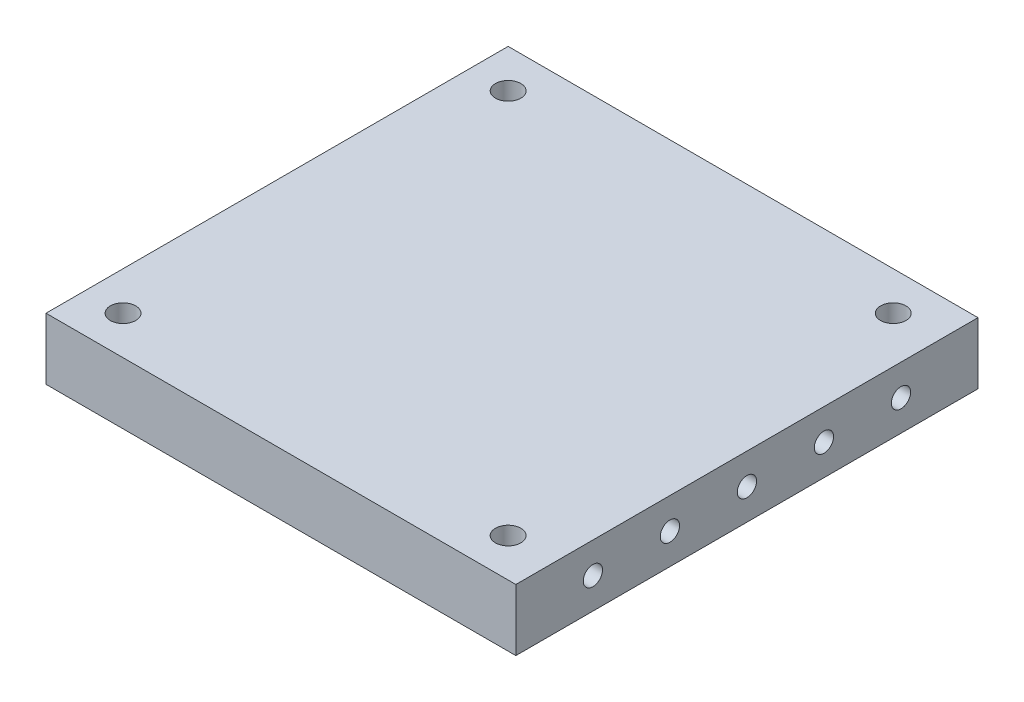
ISO-10303-21;
HEADER;
FILE_DESCRIPTION(('STEP AP214'),'2;1');
FILE_NAME('part.step','',(''),(''),'','','');
FILE_SCHEMA(('AUTOMOTIVE_DESIGN { 1 0 10303 214 1 1 1 1 }'));
ENDSEC;
DATA;
#1=APPLICATION_CONTEXT('core data for automotive mechanical design processes');
#2=APPLICATION_PROTOCOL_DEFINITION('international standard','automotive_design',2000,#1);
#3=PRODUCT_CONTEXT('',#1,'mechanical');
#4=PRODUCT('Part','Part','',(#3));
#5=PRODUCT_RELATED_PRODUCT_CATEGORY('part','',(#4));
#6=PRODUCT_DEFINITION_FORMATION('','',#4);
#7=PRODUCT_DEFINITION_CONTEXT('part definition',#1,'design');
#8=PRODUCT_DEFINITION('design','',#6,#7);
#9=PRODUCT_DEFINITION_SHAPE('','',#8);
#10=(LENGTH_UNIT() NAMED_UNIT(*) SI_UNIT(.MILLI.,.METRE.));
#11=(NAMED_UNIT(*) PLANE_ANGLE_UNIT() SI_UNIT($,.RADIAN.));
#12=(NAMED_UNIT(*) SI_UNIT($,.STERADIAN.) SOLID_ANGLE_UNIT());
#13=UNCERTAINTY_MEASURE_WITH_UNIT(LENGTH_MEASURE(1.E-05),#10,'distance_accuracy_value','');
#14=(GEOMETRIC_REPRESENTATION_CONTEXT(3) GLOBAL_UNCERTAINTY_ASSIGNED_CONTEXT((#13)) GLOBAL_UNIT_ASSIGNED_CONTEXT((#10,
#11,#12)) REPRESENTATION_CONTEXT('',''));
#15=CARTESIAN_POINT('',(0.,0.,0.));
#16=DIRECTION('',(0.,0.,1.));
#17=DIRECTION('',(1.,0.,0.));
#18=AXIS2_PLACEMENT_3D('',#15,#16,#17);
#19=CARTESIAN_POINT('',(0.,8.,0.));
#20=DIRECTION('',(1.,0.,0.));
#21=DIRECTION('',(0.,0.,-1.));
#22=AXIS2_PLACEMENT_3D('',#19,#20,#21);
#23=PLANE('',#22);
#24=DIRECTION('',(0.,0.,1.));
#25=VECTOR('',#24,1.);
#26=CARTESIAN_POINT('',(0.,0.,0.));
#27=LINE('',#26,#25);
#28=CARTESIAN_POINT('',(0.,0.,0.));
#29=VERTEX_POINT('',#28);
#30=CARTESIAN_POINT('',(0.,0.,60.));
#31=VERTEX_POINT('',#30);
#32=EDGE_CURVE('E131',#29,#31,#27,.T.);
#33=ORIENTED_EDGE('',*,*,#32,.T.);
#34=DIRECTION('',(0.,-1.,0.));
#35=VECTOR('',#34,1.);
#36=CARTESIAN_POINT('',(0.,8.,60.));
#37=LINE('',#36,#35);
#38=CARTESIAN_POINT('',(0.,8.,60.));
#39=VERTEX_POINT('',#38);
#40=EDGE_CURVE('E11',#39,#31,#37,.T.);
#41=ORIENTED_EDGE('',*,*,#40,.F.);
#42=DIRECTION('',(0.,0.,1.));
#43=VECTOR('',#42,1.);
#44=CARTESIAN_POINT('',(0.,8.,0.));
#45=LINE('',#44,#43);
#46=CARTESIAN_POINT('',(0.,8.,0.));
#47=VERTEX_POINT('',#46);
#48=EDGE_CURVE('E134',#47,#39,#45,.T.);
#49=ORIENTED_EDGE('',*,*,#48,.F.);
#50=DIRECTION('',(0.,-1.,0.));
#51=VECTOR('',#50,1.);
#52=CARTESIAN_POINT('',(0.,8.,0.));
#53=LINE('',#52,#51);
#54=EDGE_CURVE('E49',#47,#29,#53,.T.);
#55=ORIENTED_EDGE('',*,*,#54,.T.);
#56=EDGE_LOOP('',(#33,#41,#49,#55));
#57=FACE_BOUND('',#56,.T.);
#58=ADVANCED_FACE('F41',(#57),#23,.F.);
#59=CARTESIAN_POINT('',(0.,8.,60.));
#60=DIRECTION('',(0.,0.,-1.));
#61=DIRECTION('',(-1.,0.,0.));
#62=AXIS2_PLACEMENT_3D('',#59,#60,#61);
#63=PLANE('',#62);
#64=DIRECTION('',(1.,0.,0.));
#65=VECTOR('',#64,1.);
#66=CARTESIAN_POINT('',(0.,0.,60.));
#67=LINE('',#66,#65);
#68=CARTESIAN_POINT('',(61.,0.,60.));
#69=VERTEX_POINT('',#68);
#70=EDGE_CURVE('E69',#31,#69,#67,.T.);
#71=ORIENTED_EDGE('',*,*,#70,.T.);
#72=DIRECTION('',(0.,1.,0.));
#73=VECTOR('',#72,1.);
#74=CARTESIAN_POINT('',(61.,0.,60.));
#75=LINE('',#74,#73);
#76=CARTESIAN_POINT('',(61.,8.,60.));
#77=VERTEX_POINT('',#76);
#78=EDGE_CURVE('E97',#69,#77,#75,.T.);
#79=ORIENTED_EDGE('',*,*,#78,.T.);
#80=DIRECTION('',(1.,0.,0.));
#81=VECTOR('',#80,1.);
#82=CARTESIAN_POINT('',(0.,8.,60.));
#83=LINE('',#82,#81);
#84=EDGE_CURVE('E88',#39,#77,#83,.T.);
#85=ORIENTED_EDGE('',*,*,#84,.F.);
#86=ORIENTED_EDGE('',*,*,#40,.T.);
#87=EDGE_LOOP('',(#71,#79,#85,#86));
#88=FACE_BOUND('',#87,.T.);
#89=ADVANCED_FACE('F160',(#88),#63,.F.);
#90=CARTESIAN_POINT('',(0.,8.,0.));
#91=DIRECTION('',(0.,0.,1.));
#92=DIRECTION('',(1.,0.,0.));
#93=AXIS2_PLACEMENT_3D('',#90,#91,#92);
#94=PLANE('',#93);
#95=DIRECTION('',(-1.,0.,0.));
#96=VECTOR('',#95,1.);
#97=CARTESIAN_POINT('',(0.,0.,0.));
#98=LINE('',#97,#96);
#99=CARTESIAN_POINT('',(61.,0.,-5.6843418860808E-11));
#100=VERTEX_POINT('',#99);
#101=EDGE_CURVE('E74',#100,#29,#98,.T.);
#102=ORIENTED_EDGE('',*,*,#101,.T.);
#103=ORIENTED_EDGE('',*,*,#54,.F.);
#104=DIRECTION('',(-1.,0.,0.));
#105=VECTOR('',#104,1.);
#106=CARTESIAN_POINT('',(0.,8.,0.));
#107=LINE('',#106,#105);
#108=CARTESIAN_POINT('',(61.,8.,-5.6843418860808E-11));
#109=VERTEX_POINT('',#108);
#110=EDGE_CURVE('E57',#109,#47,#107,.T.);
#111=ORIENTED_EDGE('',*,*,#110,.F.);
#112=DIRECTION('',(0.,1.,0.));
#113=VECTOR('',#112,1.);
#114=CARTESIAN_POINT('',(61.,0.,-5.6843418860808E-11));
#115=LINE('',#114,#113);
#116=EDGE_CURVE('E84',#100,#109,#115,.T.);
#117=ORIENTED_EDGE('',*,*,#116,.F.);
#118=EDGE_LOOP('',(#102,#103,#111,#117));
#119=FACE_BOUND('',#118,.T.);
#120=ADVANCED_FACE('F83',(#119),#94,.F.);
#121=CARTESIAN_POINT('',(0.,8.,0.));
#122=DIRECTION('',(0.,1.,0.));
#123=DIRECTION('',(0.,0.,1.));
#124=AXIS2_PLACEMENT_3D('',#121,#122,#123);
#125=PLANE('',#124);
#126=CARTESIAN_POINT('',(55.,8.,5.));
#127=DIRECTION('',(0.,1.,0.));
#128=DIRECTION('',(0.,0.,1.));
#129=AXIS2_PLACEMENT_3D('',#126,#127,#128);
#130=CIRCLE('',#129,1.65);
#131=CARTESIAN_POINT('',(55.,8.,6.65));
#132=VERTEX_POINT('',#131);
#133=EDGE_CURVE('E116',#132,#132,#130,.T.);
#134=ORIENTED_EDGE('',*,*,#133,.F.);
#135=EDGE_LOOP('',(#134));
#136=FACE_BOUND('',#135,.T.);
#137=CARTESIAN_POINT('',(5.,8.,55.));
#138=DIRECTION('',(0.,1.,0.));
#139=DIRECTION('',(0.,0.,1.));
#140=AXIS2_PLACEMENT_3D('',#137,#138,#139);
#141=CIRCLE('',#140,1.65);
#142=CARTESIAN_POINT('',(5.,8.,56.65));
#143=VERTEX_POINT('',#142);
#144=EDGE_CURVE('E123',#143,#143,#141,.T.);
#145=ORIENTED_EDGE('',*,*,#144,.F.);
#146=EDGE_LOOP('',(#145));
#147=FACE_BOUND('',#146,.T.);
#148=CARTESIAN_POINT('',(55.,8.,55.));
#149=DIRECTION('',(0.,1.,0.));
#150=DIRECTION('',(0.,0.,1.));
#151=AXIS2_PLACEMENT_3D('',#148,#149,#150);
#152=CIRCLE('',#151,1.65);
#153=CARTESIAN_POINT('',(55.,8.,56.65));
#154=VERTEX_POINT('',#153);
#155=EDGE_CURVE('E110',#154,#154,#152,.T.);
#156=ORIENTED_EDGE('',*,*,#155,.F.);
#157=EDGE_LOOP('',(#156));
#158=FACE_BOUND('',#157,.T.);
#159=CARTESIAN_POINT('',(5.,8.,5.));
#160=DIRECTION('',(0.,1.,0.));
#161=DIRECTION('',(0.,0.,1.));
#162=AXIS2_PLACEMENT_3D('',#159,#160,#161);
#163=CIRCLE('',#162,1.65);
#164=CARTESIAN_POINT('',(5.,8.,6.65));
#165=VERTEX_POINT('',#164);
#166=EDGE_CURVE('E119',#165,#165,#163,.T.);
#167=ORIENTED_EDGE('',*,*,#166,.F.);
#168=EDGE_LOOP('',(#167));
#169=FACE_BOUND('',#168,.T.);
#170=ORIENTED_EDGE('',*,*,#48,.T.);
#171=ORIENTED_EDGE('',*,*,#84,.T.);
#172=DIRECTION('',(0.,0.,-1.));
#173=VECTOR('',#172,1.);
#174=CARTESIAN_POINT('',(61.,8.,60.));
#175=LINE('',#174,#173);
#176=EDGE_CURVE('E94',#77,#109,#175,.T.);
#177=ORIENTED_EDGE('',*,*,#176,.T.);
#178=ORIENTED_EDGE('',*,*,#110,.T.);
#179=EDGE_LOOP('',(#170,#171,#177,#178));
#180=FACE_BOUND('',#179,.T.);
#181=ADVANCED_FACE('F99',(#136,#147,#158,#169,#180),#125,.T.);
#182=CARTESIAN_POINT('',(0.,0.,0.));
#183=DIRECTION('',(0.,1.,0.));
#184=DIRECTION('',(0.,0.,1.));
#185=AXIS2_PLACEMENT_3D('',#182,#183,#184);
#186=PLANE('',#185);
#187=CARTESIAN_POINT('',(55.,0.,5.));
#188=DIRECTION('',(0.,1.,0.));
#189=DIRECTION('',(0.,0.,1.));
#190=AXIS2_PLACEMENT_3D('',#187,#188,#189);
#191=CIRCLE('',#190,1.65);
#192=CARTESIAN_POINT('',(55.,0.,6.65));
#193=VERTEX_POINT('',#192);
#194=EDGE_CURVE('E120',#193,#193,#191,.T.);
#195=ORIENTED_EDGE('',*,*,#194,.T.);
#196=EDGE_LOOP('',(#195));
#197=FACE_BOUND('',#196,.T.);
#198=CARTESIAN_POINT('',(5.,0.,55.));
#199=DIRECTION('',(0.,1.,0.));
#200=DIRECTION('',(0.,0.,1.));
#201=AXIS2_PLACEMENT_3D('',#198,#199,#200);
#202=CIRCLE('',#201,1.65);
#203=CARTESIAN_POINT('',(5.,0.,56.65));
#204=VERTEX_POINT('',#203);
#205=EDGE_CURVE('E113',#204,#204,#202,.T.);
#206=ORIENTED_EDGE('',*,*,#205,.T.);
#207=EDGE_LOOP('',(#206));
#208=FACE_BOUND('',#207,.T.);
#209=CARTESIAN_POINT('',(55.,0.,55.));
#210=DIRECTION('',(0.,1.,0.));
#211=DIRECTION('',(0.,0.,1.));
#212=AXIS2_PLACEMENT_3D('',#209,#210,#211);
#213=CIRCLE('',#212,1.65);
#214=CARTESIAN_POINT('',(55.,0.,56.65));
#215=VERTEX_POINT('',#214);
#216=EDGE_CURVE('E96',#215,#215,#213,.T.);
#217=ORIENTED_EDGE('',*,*,#216,.T.);
#218=EDGE_LOOP('',(#217));
#219=FACE_BOUND('',#218,.T.);
#220=CARTESIAN_POINT('',(5.,0.,5.));
#221=DIRECTION('',(0.,1.,0.));
#222=DIRECTION('',(0.,0.,1.));
#223=AXIS2_PLACEMENT_3D('',#220,#221,#222);
#224=CIRCLE('',#223,1.65);
#225=CARTESIAN_POINT('',(5.,0.,6.65));
#226=VERTEX_POINT('',#225);
#227=EDGE_CURVE('E128',#226,#226,#224,.T.);
#228=ORIENTED_EDGE('',*,*,#227,.T.);
#229=EDGE_LOOP('',(#228));
#230=FACE_BOUND('',#229,.T.);
#231=ORIENTED_EDGE('',*,*,#32,.F.);
#232=ORIENTED_EDGE('',*,*,#101,.F.);
#233=DIRECTION('',(0.,0.,-1.));
#234=VECTOR('',#233,1.);
#235=CARTESIAN_POINT('',(61.,0.,60.));
#236=LINE('',#235,#234);
#237=EDGE_CURVE('E95',#69,#100,#236,.T.);
#238=ORIENTED_EDGE('',*,*,#237,.F.);
#239=ORIENTED_EDGE('',*,*,#70,.F.);
#240=EDGE_LOOP('',(#231,#232,#238,#239));
#241=FACE_BOUND('',#240,.T.);
#242=ADVANCED_FACE('F142',(#197,#208,#219,#230,#241),#186,.F.);
#243=CARTESIAN_POINT('',(5.,0.,5.));
#244=DIRECTION('',(0.,1.,0.));
#245=DIRECTION('',(0.,0.,1.));
#246=AXIS2_PLACEMENT_3D('',#243,#244,#245);
#247=CYLINDRICAL_SURFACE('',#246,1.65);
#248=ORIENTED_EDGE('',*,*,#227,.F.);
#249=EDGE_LOOP('',(#248));
#250=FACE_BOUND('',#249,.T.);
#251=ORIENTED_EDGE('',*,*,#166,.T.);
#252=EDGE_LOOP('',(#251));
#253=FACE_BOUND('',#252,.T.);
#254=ADVANCED_FACE('F144',(#250,#253),#247,.F.);
#255=CARTESIAN_POINT('',(55.,0.,55.));
#256=DIRECTION('',(0.,1.,0.));
#257=DIRECTION('',(0.,0.,1.));
#258=AXIS2_PLACEMENT_3D('',#255,#256,#257);
#259=CYLINDRICAL_SURFACE('',#258,1.65);
#260=ORIENTED_EDGE('',*,*,#216,.F.);
#261=EDGE_LOOP('',(#260));
#262=FACE_BOUND('',#261,.T.);
#263=ORIENTED_EDGE('',*,*,#155,.T.);
#264=EDGE_LOOP('',(#263));
#265=FACE_BOUND('',#264,.T.);
#266=ADVANCED_FACE('F152',(#262,#265),#259,.F.);
#267=CARTESIAN_POINT('',(5.,0.,55.));
#268=DIRECTION('',(0.,1.,0.));
#269=DIRECTION('',(0.,0.,1.));
#270=AXIS2_PLACEMENT_3D('',#267,#268,#269);
#271=CYLINDRICAL_SURFACE('',#270,1.65);
#272=ORIENTED_EDGE('',*,*,#205,.F.);
#273=EDGE_LOOP('',(#272));
#274=FACE_BOUND('',#273,.T.);
#275=ORIENTED_EDGE('',*,*,#144,.T.);
#276=EDGE_LOOP('',(#275));
#277=FACE_BOUND('',#276,.T.);
#278=ADVANCED_FACE('F302',(#274,#277),#271,.F.);
#279=CARTESIAN_POINT('',(55.,0.,5.));
#280=DIRECTION('',(0.,1.,0.));
#281=DIRECTION('',(0.,0.,1.));
#282=AXIS2_PLACEMENT_3D('',#279,#280,#281);
#283=CYLINDRICAL_SURFACE('',#282,1.65);
#284=ORIENTED_EDGE('',*,*,#194,.F.);
#285=EDGE_LOOP('',(#284));
#286=FACE_BOUND('',#285,.T.);
#287=ORIENTED_EDGE('',*,*,#133,.T.);
#288=EDGE_LOOP('',(#287));
#289=FACE_BOUND('',#288,.T.);
#290=ADVANCED_FACE('F195',(#286,#289),#283,.F.);
#291=CARTESIAN_POINT('',(61.,0.,60.));
#292=DIRECTION('',(1.,0.,0.));
#293=DIRECTION('',(0.,0.,-1.));
#294=AXIS2_PLACEMENT_3D('',#291,#292,#293);
#295=PLANE('',#294);
#296=CARTESIAN_POINT('',(61.,4.,50.));
#297=DIRECTION('',(1.,0.,0.));
#298=DIRECTION('',(0.,0.,-1.));
#299=AXIS2_PLACEMENT_3D('',#296,#297,#298);
#300=CIRCLE('',#299,1.25);
#301=CARTESIAN_POINT('',(61.,4.,48.75));
#302=VERTEX_POINT('',#301);
#303=EDGE_CURVE('E105',#302,#302,#300,.T.);
#304=ORIENTED_EDGE('',*,*,#303,.F.);
#305=EDGE_LOOP('',(#304));
#306=FACE_BOUND('',#305,.T.);
#307=CARTESIAN_POINT('',(61.,4.,40.));
#308=DIRECTION('',(1.,0.,0.));
#309=DIRECTION('',(0.,0.,-1.));
#310=AXIS2_PLACEMENT_3D('',#307,#308,#309);
#311=CIRCLE('',#310,1.25);
#312=CARTESIAN_POINT('',(61.,4.,38.75));
#313=VERTEX_POINT('',#312);
#314=EDGE_CURVE('E368',#313,#313,#311,.T.);
#315=ORIENTED_EDGE('',*,*,#314,.F.);
#316=EDGE_LOOP('',(#315));
#317=FACE_BOUND('',#316,.T.);
#318=CARTESIAN_POINT('',(61.,4.,30.));
#319=DIRECTION('',(1.,0.,0.));
#320=DIRECTION('',(0.,0.,-1.));
#321=AXIS2_PLACEMENT_3D('',#318,#319,#320);
#322=CIRCLE('',#321,1.25);
#323=CARTESIAN_POINT('',(61.,4.,28.75));
#324=VERTEX_POINT('',#323);
#325=EDGE_CURVE('E376',#324,#324,#322,.T.);
#326=ORIENTED_EDGE('',*,*,#325,.F.);
#327=EDGE_LOOP('',(#326));
#328=FACE_BOUND('',#327,.T.);
#329=CARTESIAN_POINT('',(61.,4.,10.));
#330=DIRECTION('',(1.,0.,0.));
#331=DIRECTION('',(0.,0.,-1.));
#332=AXIS2_PLACEMENT_3D('',#329,#330,#331);
#333=CIRCLE('',#332,1.25);
#334=CARTESIAN_POINT('',(61.,4.,8.75));
#335=VERTEX_POINT('',#334);
#336=EDGE_CURVE('E382',#335,#335,#333,.T.);
#337=ORIENTED_EDGE('',*,*,#336,.F.);
#338=EDGE_LOOP('',(#337));
#339=FACE_BOUND('',#338,.T.);
#340=CARTESIAN_POINT('',(61.,4.,20.));
#341=DIRECTION('',(1.,0.,0.));
#342=DIRECTION('',(0.,0.,-1.));
#343=AXIS2_PLACEMENT_3D('',#340,#341,#342);
#344=CIRCLE('',#343,1.25);
#345=CARTESIAN_POINT('',(61.,4.,18.75));
#346=VERTEX_POINT('',#345);
#347=EDGE_CURVE('E388',#346,#346,#344,.T.);
#348=ORIENTED_EDGE('',*,*,#347,.F.);
#349=EDGE_LOOP('',(#348));
#350=FACE_BOUND('',#349,.T.);
#351=ORIENTED_EDGE('',*,*,#176,.F.);
#352=ORIENTED_EDGE('',*,*,#78,.F.);
#353=ORIENTED_EDGE('',*,*,#237,.T.);
#354=ORIENTED_EDGE('',*,*,#116,.T.);
#355=EDGE_LOOP('',(#351,#352,#353,#354));
#356=FACE_BOUND('',#355,.T.);
#357=ADVANCED_FACE('F92',(#306,#317,#328,#339,#350,#356),#295,.T.);
#358=CARTESIAN_POINT('',(52.,4.,20.));
#359=DIRECTION('',(1.,0.,0.));
#360=DIRECTION('',(0.,0.,-1.));
#361=AXIS2_PLACEMENT_3D('',#358,#359,#360);
#362=CYLINDRICAL_SURFACE('',#361,1.25);
#363=CARTESIAN_POINT('',(52.,4.,20.));
#364=DIRECTION('',(1.,0.,0.));
#365=DIRECTION('',(0.,0.,-1.));
#366=AXIS2_PLACEMENT_3D('',#363,#364,#365);
#367=CIRCLE('',#366,1.25);
#368=CARTESIAN_POINT('',(52.,4.,18.75));
#369=VERTEX_POINT('',#368);
#370=EDGE_CURVE('E390',#369,#369,#367,.T.);
#371=ORIENTED_EDGE('',*,*,#370,.F.);
#372=EDGE_LOOP('',(#371));
#373=FACE_BOUND('',#372,.T.);
#374=ORIENTED_EDGE('',*,*,#347,.T.);
#375=EDGE_LOOP('',(#374));
#376=FACE_BOUND('',#375,.T.);
#377=ADVANCED_FACE('F194',(#373,#376),#362,.F.);
#378=CARTESIAN_POINT('',(52.,4.,20.));
#379=DIRECTION('',(1.,0.,0.));
#380=DIRECTION('',(0.,0.,-1.));
#381=AXIS2_PLACEMENT_3D('',#378,#379,#380);
#382=PLANE('',#381);
#383=ORIENTED_EDGE('',*,*,#370,.T.);
#384=EDGE_LOOP('',(#383));
#385=FACE_BOUND('',#384,.T.);
#386=ADVANCED_FACE('F206',(#385),#382,.T.);
#387=CARTESIAN_POINT('',(52.,4.,10.));
#388=DIRECTION('',(1.,0.,0.));
#389=DIRECTION('',(0.,0.,-1.));
#390=AXIS2_PLACEMENT_3D('',#387,#388,#389);
#391=CYLINDRICAL_SURFACE('',#390,1.25);
#392=CARTESIAN_POINT('',(52.,4.,10.));
#393=DIRECTION('',(1.,0.,0.));
#394=DIRECTION('',(0.,0.,-1.));
#395=AXIS2_PLACEMENT_3D('',#392,#393,#394);
#396=CIRCLE('',#395,1.25);
#397=CARTESIAN_POINT('',(52.,4.,8.75));
#398=VERTEX_POINT('',#397);
#399=EDGE_CURVE('E385',#398,#398,#396,.T.);
#400=ORIENTED_EDGE('',*,*,#399,.F.);
#401=EDGE_LOOP('',(#400));
#402=FACE_BOUND('',#401,.T.);
#403=ORIENTED_EDGE('',*,*,#336,.T.);
#404=EDGE_LOOP('',(#403));
#405=FACE_BOUND('',#404,.T.);
#406=ADVANCED_FACE('F216',(#402,#405),#391,.F.);
#407=CARTESIAN_POINT('',(52.,4.,10.));
#408=DIRECTION('',(1.,0.,0.));
#409=DIRECTION('',(0.,0.,-1.));
#410=AXIS2_PLACEMENT_3D('',#407,#408,#409);
#411=PLANE('',#410);
#412=ORIENTED_EDGE('',*,*,#399,.T.);
#413=EDGE_LOOP('',(#412));
#414=FACE_BOUND('',#413,.T.);
#415=ADVANCED_FACE('F226',(#414),#411,.T.);
#416=CARTESIAN_POINT('',(52.,4.,30.));
#417=DIRECTION('',(1.,0.,0.));
#418=DIRECTION('',(0.,0.,-1.));
#419=AXIS2_PLACEMENT_3D('',#416,#417,#418);
#420=CYLINDRICAL_SURFACE('',#419,1.25);
#421=CARTESIAN_POINT('',(52.,4.,30.));
#422=DIRECTION('',(1.,0.,0.));
#423=DIRECTION('',(0.,0.,-1.));
#424=AXIS2_PLACEMENT_3D('',#421,#422,#423);
#425=CIRCLE('',#424,1.25);
#426=CARTESIAN_POINT('',(52.,4.,28.75));
#427=VERTEX_POINT('',#426);
#428=EDGE_CURVE('E379',#427,#427,#425,.T.);
#429=ORIENTED_EDGE('',*,*,#428,.F.);
#430=EDGE_LOOP('',(#429));
#431=FACE_BOUND('',#430,.T.);
#432=ORIENTED_EDGE('',*,*,#325,.T.);
#433=EDGE_LOOP('',(#432));
#434=FACE_BOUND('',#433,.T.);
#435=ADVANCED_FACE('F236',(#431,#434),#420,.F.);
#436=CARTESIAN_POINT('',(52.,4.,30.));
#437=DIRECTION('',(1.,0.,0.));
#438=DIRECTION('',(0.,0.,-1.));
#439=AXIS2_PLACEMENT_3D('',#436,#437,#438);
#440=PLANE('',#439);
#441=ORIENTED_EDGE('',*,*,#428,.T.);
#442=EDGE_LOOP('',(#441));
#443=FACE_BOUND('',#442,.T.);
#444=ADVANCED_FACE('F246',(#443),#440,.T.);
#445=CARTESIAN_POINT('',(52.,4.,40.));
#446=DIRECTION('',(1.,0.,0.));
#447=DIRECTION('',(0.,0.,-1.));
#448=AXIS2_PLACEMENT_3D('',#445,#446,#447);
#449=CYLINDRICAL_SURFACE('',#448,1.25);
#450=CARTESIAN_POINT('',(52.,4.,40.));
#451=DIRECTION('',(1.,0.,0.));
#452=DIRECTION('',(0.,0.,-1.));
#453=AXIS2_PLACEMENT_3D('',#450,#451,#452);
#454=CIRCLE('',#453,1.25);
#455=CARTESIAN_POINT('',(52.,4.,38.75));
#456=VERTEX_POINT('',#455);
#457=EDGE_CURVE('E371',#456,#456,#454,.T.);
#458=ORIENTED_EDGE('',*,*,#457,.F.);
#459=EDGE_LOOP('',(#458));
#460=FACE_BOUND('',#459,.T.);
#461=ORIENTED_EDGE('',*,*,#314,.T.);
#462=EDGE_LOOP('',(#461));
#463=FACE_BOUND('',#462,.T.);
#464=ADVANCED_FACE('F256',(#460,#463),#449,.F.);
#465=CARTESIAN_POINT('',(52.,4.,40.));
#466=DIRECTION('',(1.,0.,0.));
#467=DIRECTION('',(0.,0.,-1.));
#468=AXIS2_PLACEMENT_3D('',#465,#466,#467);
#469=PLANE('',#468);
#470=ORIENTED_EDGE('',*,*,#457,.T.);
#471=EDGE_LOOP('',(#470));
#472=FACE_BOUND('',#471,.T.);
#473=ADVANCED_FACE('F266',(#472),#469,.T.);
#474=CARTESIAN_POINT('',(52.,4.,50.));
#475=DIRECTION('',(1.,0.,0.));
#476=DIRECTION('',(0.,0.,-1.));
#477=AXIS2_PLACEMENT_3D('',#474,#475,#476);
#478=CYLINDRICAL_SURFACE('',#477,1.25);
#479=CARTESIAN_POINT('',(52.,4.,50.));
#480=DIRECTION('',(1.,0.,0.));
#481=DIRECTION('',(0.,0.,-1.));
#482=AXIS2_PLACEMENT_3D('',#479,#480,#481);
#483=CIRCLE('',#482,1.25);
#484=CARTESIAN_POINT('',(52.,4.,48.75));
#485=VERTEX_POINT('',#484);
#486=EDGE_CURVE('E101',#485,#485,#483,.T.);
#487=ORIENTED_EDGE('',*,*,#486,.F.);
#488=EDGE_LOOP('',(#487));
#489=FACE_BOUND('',#488,.T.);
#490=ORIENTED_EDGE('',*,*,#303,.T.);
#491=EDGE_LOOP('',(#490));
#492=FACE_BOUND('',#491,.T.);
#493=ADVANCED_FACE('F276',(#489,#492),#478,.F.);
#494=CARTESIAN_POINT('',(52.,4.,50.));
#495=DIRECTION('',(1.,0.,0.));
#496=DIRECTION('',(0.,0.,-1.));
#497=AXIS2_PLACEMENT_3D('',#494,#495,#496);
#498=PLANE('',#497);
#499=ORIENTED_EDGE('',*,*,#486,.T.);
#500=EDGE_LOOP('',(#499));
#501=FACE_BOUND('',#500,.T.);
#502=ADVANCED_FACE('F286',(#501),#498,.T.);
#503=CLOSED_SHELL('',(#58,#89,#120,#181,#242,#254,#266,#278,#290,#357,#377,#386,#406,#415,#435,
#444,#464,#473,#493,#502));
#504=MANIFOLD_SOLID_BREP('B2',#503);
#505=ADVANCED_BREP_SHAPE_REPRESENTATION('',(#18,#504),#14);
#506=SHAPE_DEFINITION_REPRESENTATION(#9,#505);
ENDSEC;
END-ISO-10303-21;
